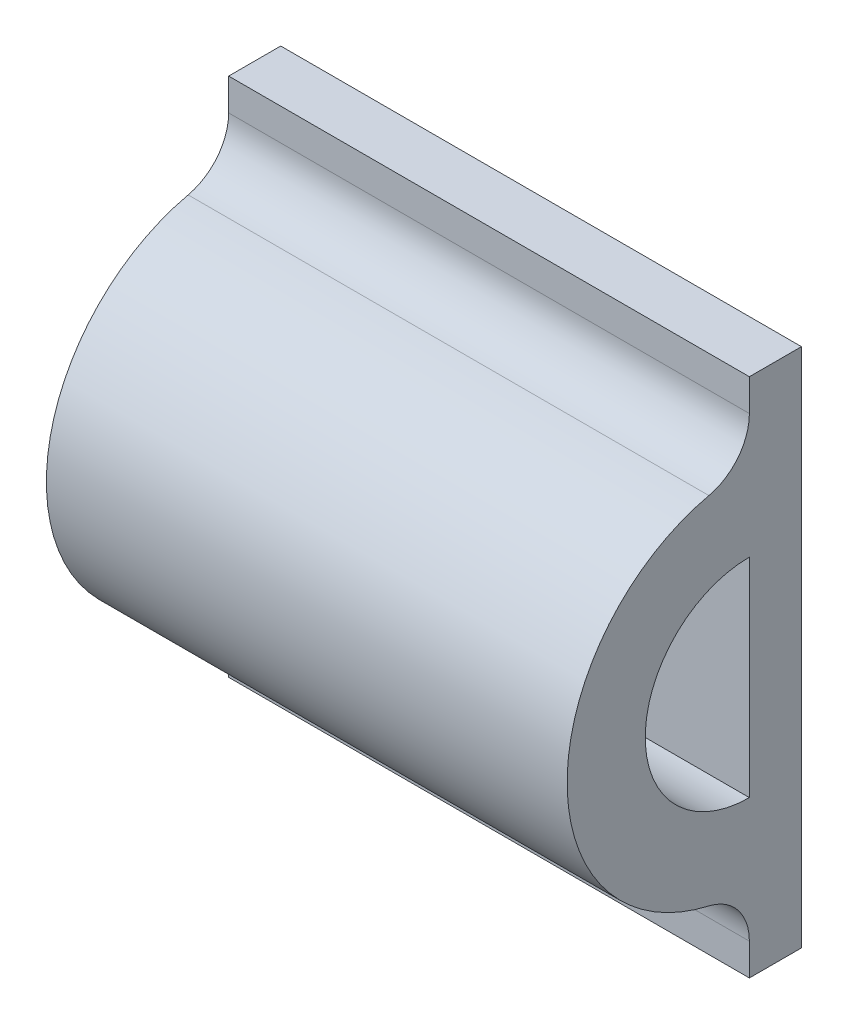
ISO-10303-21;
HEADER;
FILE_DESCRIPTION(('STEP AP214'),'2;1');
FILE_NAME('part.step','',(''),(''),'','','');
FILE_SCHEMA(('AUTOMOTIVE_DESIGN { 1 0 10303 214 1 1 1 1 }'));
ENDSEC;
DATA;
#1=APPLICATION_CONTEXT('core data for automotive mechanical design processes');
#2=APPLICATION_PROTOCOL_DEFINITION('international standard','automotive_design',2000,#1);
#3=PRODUCT_CONTEXT('',#1,'mechanical');
#4=PRODUCT('Part','Part','',(#3));
#5=PRODUCT_RELATED_PRODUCT_CATEGORY('part','',(#4));
#6=PRODUCT_DEFINITION_FORMATION('','',#4);
#7=PRODUCT_DEFINITION_CONTEXT('part definition',#1,'design');
#8=PRODUCT_DEFINITION('design','',#6,#7);
#9=PRODUCT_DEFINITION_SHAPE('','',#8);
#10=(LENGTH_UNIT() NAMED_UNIT(*) SI_UNIT(.MILLI.,.METRE.));
#11=(NAMED_UNIT(*) PLANE_ANGLE_UNIT() SI_UNIT($,.RADIAN.));
#12=(NAMED_UNIT(*) SI_UNIT($,.STERADIAN.) SOLID_ANGLE_UNIT());
#13=UNCERTAINTY_MEASURE_WITH_UNIT(LENGTH_MEASURE(1.E-05),#10,'distance_accuracy_value','');
#14=(GEOMETRIC_REPRESENTATION_CONTEXT(3) GLOBAL_UNCERTAINTY_ASSIGNED_CONTEXT((#13)) GLOBAL_UNIT_ASSIGNED_CONTEXT((#10,
#11,#12)) REPRESENTATION_CONTEXT('',''));
#15=CARTESIAN_POINT('',(0.,0.,0.));
#16=DIRECTION('',(0.,0.,1.));
#17=DIRECTION('',(1.,0.,0.));
#18=AXIS2_PLACEMENT_3D('',#15,#16,#17);
#19=CARTESIAN_POINT('',(-5.,-4.38748219369606,2.));
#20=DIRECTION('',(1.,0.,0.));
#21=DIRECTION('',(0.,0.,-1.));
#22=AXIS2_PLACEMENT_3D('',#19,#20,#21);
#23=CYLINDRICAL_SURFACE('',#22,1.);
#24=DIRECTION('',(-1.,0.,0.));
#25=VECTOR('',#24,1.);
#26=CARTESIAN_POINT('',(-5.,-4.38748219369606,1.));
#27=LINE('',#26,#25);
#28=CARTESIAN_POINT('',(5.,-4.38748219369606,1.));
#29=VERTEX_POINT('',#28);
#30=CARTESIAN_POINT('',(-5.,-4.38748219369606,1.));
#31=VERTEX_POINT('',#30);
#32=EDGE_CURVE('E212',#29,#31,#27,.T.);
#33=ORIENTED_EDGE('',*,*,#32,.F.);
#34=CARTESIAN_POINT('',(5.,-4.38748219369606,2.));
#35=DIRECTION('',(-1.,0.,0.));
#36=DIRECTION('',(0.,0.,1.));
#37=AXIS2_PLACEMENT_3D('',#34,#35,#36);
#38=CIRCLE('',#37,1.);
#39=CARTESIAN_POINT('',(5.,-3.41248615065247,1.77777777777786));
#40=VERTEX_POINT('',#39);
#41=EDGE_CURVE('E53',#29,#40,#38,.F.);
#42=ORIENTED_EDGE('',*,*,#41,.T.);
#43=DIRECTION('',(1.,0.,0.));
#44=VECTOR('',#43,1.);
#45=CARTESIAN_POINT('',(-5.,-3.41248615065249,1.77777777777778));
#46=LINE('',#45,#44);
#47=CARTESIAN_POINT('',(-5.,-3.41248615065247,1.77777777777786));
#48=VERTEX_POINT('',#47);
#49=EDGE_CURVE('E216',#48,#40,#46,.T.);
#50=ORIENTED_EDGE('',*,*,#49,.F.);
#51=CARTESIAN_POINT('',(-5.,-4.38748219369606,2.));
#52=DIRECTION('',(1.,0.,0.));
#53=DIRECTION('',(0.,0.,-1.));
#54=AXIS2_PLACEMENT_3D('',#51,#52,#53);
#55=CIRCLE('',#54,1.);
#56=EDGE_CURVE('E11',#48,#31,#55,.F.);
#57=ORIENTED_EDGE('',*,*,#56,.T.);
#58=EDGE_LOOP('',(#33,#42,#50,#57));
#59=FACE_BOUND('',#58,.T.);
#60=ADVANCED_FACE('F45',(#59),#23,.F.);
#61=CARTESIAN_POINT('',(-5.,4.38748219369606,2.));
#62=DIRECTION('',(1.,0.,0.));
#63=DIRECTION('',(0.,0.,-1.));
#64=AXIS2_PLACEMENT_3D('',#61,#62,#63);
#65=CYLINDRICAL_SURFACE('',#64,1.);
#66=DIRECTION('',(-1.,0.,0.));
#67=VECTOR('',#66,1.);
#68=CARTESIAN_POINT('',(-5.,4.38748219369606,1.));
#69=LINE('',#68,#67);
#70=CARTESIAN_POINT('',(-5.,4.38748219369606,1.));
#71=VERTEX_POINT('',#70);
#72=CARTESIAN_POINT('',(5.,4.38748219369606,1.));
#73=VERTEX_POINT('',#72);
#74=EDGE_CURVE('E197',#71,#73,#69,.F.);
#75=ORIENTED_EDGE('',*,*,#74,.F.);
#76=CARTESIAN_POINT('',(-5.,4.38748219369606,2.));
#77=DIRECTION('',(1.,0.,0.));
#78=DIRECTION('',(0.,0.,-1.));
#79=AXIS2_PLACEMENT_3D('',#76,#77,#78);
#80=CIRCLE('',#79,1.);
#81=CARTESIAN_POINT('',(-5.,3.41248615065249,1.77777777777778));
#82=VERTEX_POINT('',#81);
#83=EDGE_CURVE('E205',#71,#82,#80,.F.);
#84=ORIENTED_EDGE('',*,*,#83,.T.);
#85=DIRECTION('',(1.,0.,0.));
#86=VECTOR('',#85,1.);
#87=CARTESIAN_POINT('',(-5.,3.41248615065249,1.77777777777778));
#88=LINE('',#87,#86);
#89=CARTESIAN_POINT('',(5.,3.41248615065249,1.77777777777778));
#90=VERTEX_POINT('',#89);
#91=EDGE_CURVE('E201',#90,#82,#88,.F.);
#92=ORIENTED_EDGE('',*,*,#91,.F.);
#93=CARTESIAN_POINT('',(5.,4.38748219369606,2.));
#94=DIRECTION('',(-1.,0.,0.));
#95=DIRECTION('',(0.,0.,1.));
#96=AXIS2_PLACEMENT_3D('',#93,#94,#95);
#97=CIRCLE('',#96,1.);
#98=EDGE_CURVE('E209',#90,#73,#97,.F.);
#99=ORIENTED_EDGE('',*,*,#98,.T.);
#100=EDGE_LOOP('',(#75,#84,#92,#99));
#101=FACE_BOUND('',#100,.T.);
#102=ADVANCED_FACE('F240',(#101),#65,.F.);
#103=CARTESIAN_POINT('',(0.,0.,1.));
#104=DIRECTION('',(0.,0.,-1.));
#105=DIRECTION('',(-1.,0.,0.));
#106=AXIS2_PLACEMENT_3D('',#103,#104,#105);
#107=PLANE('',#106);
#108=DIRECTION('',(0.,-1.,0.));
#109=VECTOR('',#108,1.);
#110=CARTESIAN_POINT('',(-5.,5.,1.));
#111=LINE('',#110,#109);
#112=CARTESIAN_POINT('',(-5.,5.,1.));
#113=VERTEX_POINT('',#112);
#114=EDGE_CURVE('E156',#113,#71,#111,.T.);
#115=ORIENTED_EDGE('',*,*,#114,.T.);
#116=ORIENTED_EDGE('',*,*,#74,.T.);
#117=DIRECTION('',(0.,1.,0.));
#118=VECTOR('',#117,1.);
#119=CARTESIAN_POINT('',(5.,5.,1.));
#120=LINE('',#119,#118);
#121=CARTESIAN_POINT('',(5.,5.,1.));
#122=VERTEX_POINT('',#121);
#123=EDGE_CURVE('E128',#73,#122,#120,.T.);
#124=ORIENTED_EDGE('',*,*,#123,.T.);
#125=DIRECTION('',(-1.,0.,0.));
#126=VECTOR('',#125,1.);
#127=CARTESIAN_POINT('',(5.,5.,1.));
#128=LINE('',#127,#126);
#129=EDGE_CURVE('E166',#122,#113,#128,.T.);
#130=ORIENTED_EDGE('',*,*,#129,.T.);
#131=EDGE_LOOP('',(#115,#116,#124,#130));
#132=FACE_BOUND('',#131,.T.);
#133=ADVANCED_FACE('F236',(#132),#107,.F.);
#134=CARTESIAN_POINT('',(5.,-5.,1.));
#135=VERTEX_POINT('',#134);
#136=EDGE_CURVE('E127',#135,#29,#120,.T.);
#137=ORIENTED_EDGE('',*,*,#136,.T.);
#138=ORIENTED_EDGE('',*,*,#32,.T.);
#139=CARTESIAN_POINT('',(-5.,-5.,1.));
#140=VERTEX_POINT('',#139);
#141=EDGE_CURVE('E161',#31,#140,#111,.T.);
#142=ORIENTED_EDGE('',*,*,#141,.T.);
#143=DIRECTION('',(1.,0.,0.));
#144=VECTOR('',#143,1.);
#145=CARTESIAN_POINT('',(5.,-5.,1.));
#146=LINE('',#145,#144);
#147=EDGE_CURVE('E160',#140,#135,#146,.T.);
#148=ORIENTED_EDGE('',*,*,#147,.T.);
#149=EDGE_LOOP('',(#137,#138,#142,#148));
#150=FACE_BOUND('',#149,.T.);
#151=ADVANCED_FACE('F227',(#150),#107,.F.);
#152=CARTESIAN_POINT('',(-5.,5.,1.));
#153=DIRECTION('',(1.,0.,0.));
#154=DIRECTION('',(0.,0.,-1.));
#155=AXIS2_PLACEMENT_3D('',#152,#153,#154);
#156=PLANE('',#155);
#157=ORIENTED_EDGE('',*,*,#56,.F.);
#158=CARTESIAN_POINT('',(-5.,0.,1.));
#159=DIRECTION('',(-1.,0.,0.));
#160=DIRECTION('',(0.,0.,1.));
#161=AXIS2_PLACEMENT_3D('',#158,#159,#160);
#162=CIRCLE('',#161,3.5);
#163=EDGE_CURVE('E144',#48,#82,#162,.T.);
#164=ORIENTED_EDGE('',*,*,#163,.T.);
#165=ORIENTED_EDGE('',*,*,#83,.F.);
#166=ORIENTED_EDGE('',*,*,#114,.F.);
#167=DIRECTION('',(0.,0.,-1.));
#168=VECTOR('',#167,1.);
#169=CARTESIAN_POINT('',(-5.,5.,1.));
#170=LINE('',#169,#168);
#171=CARTESIAN_POINT('',(-5.,5.,0.));
#172=VERTEX_POINT('',#171);
#173=EDGE_CURVE('E169',#113,#172,#170,.T.);
#174=ORIENTED_EDGE('',*,*,#173,.T.);
#175=DIRECTION('',(0.,-1.,0.));
#176=VECTOR('',#175,1.);
#177=CARTESIAN_POINT('',(-5.,5.,0.));
#178=LINE('',#177,#176);
#179=CARTESIAN_POINT('',(-5.,-5.,0.));
#180=VERTEX_POINT('',#179);
#181=EDGE_CURVE('E154',#172,#180,#178,.T.);
#182=ORIENTED_EDGE('',*,*,#181,.T.);
#183=DIRECTION('',(0.,0.,-1.));
#184=VECTOR('',#183,1.);
#185=CARTESIAN_POINT('',(-5.,-5.,1.));
#186=LINE('',#185,#184);
#187=EDGE_CURVE('E193',#140,#180,#186,.T.);
#188=ORIENTED_EDGE('',*,*,#187,.F.);
#189=ORIENTED_EDGE('',*,*,#141,.F.);
#190=EDGE_LOOP('',(#157,#164,#165,#166,#174,#182,#188,#189));
#191=FACE_BOUND('',#190,.T.);
#192=CARTESIAN_POINT('',(-5.,0.,1.));
#193=DIRECTION('',(-1.,0.,0.));
#194=DIRECTION('',(0.,0.,1.));
#195=AXIS2_PLACEMENT_3D('',#192,#193,#194);
#196=CIRCLE('',#195,2.);
#197=CARTESIAN_POINT('',(-5.,-2.,1.));
#198=VERTEX_POINT('',#197);
#199=CARTESIAN_POINT('',(-5.,2.,1.));
#200=VERTEX_POINT('',#199);
#201=EDGE_CURVE('E140',#198,#200,#196,.T.);
#202=ORIENTED_EDGE('',*,*,#201,.F.);
#203=EDGE_CURVE('E134',#200,#198,#111,.T.);
#204=ORIENTED_EDGE('',*,*,#203,.F.);
#205=EDGE_LOOP('',(#202,#204));
#206=FACE_BOUND('',#205,.T.);
#207=ADVANCED_FACE('F224',(#191,#206),#156,.F.);
#208=CARTESIAN_POINT('',(5.,-5.,1.));
#209=DIRECTION('',(0.,1.,0.));
#210=DIRECTION('',(-1.,0.,0.));
#211=AXIS2_PLACEMENT_3D('',#208,#209,#210);
#212=PLANE('',#211);
#213=DIRECTION('',(1.,0.,0.));
#214=VECTOR('',#213,1.);
#215=CARTESIAN_POINT('',(5.,-5.,0.));
#216=LINE('',#215,#214);
#217=CARTESIAN_POINT('',(5.,-5.,0.));
#218=VERTEX_POINT('',#217);
#219=EDGE_CURVE('E173',#180,#218,#216,.T.);
#220=ORIENTED_EDGE('',*,*,#219,.T.);
#221=DIRECTION('',(0.,0.,-1.));
#222=VECTOR('',#221,1.);
#223=CARTESIAN_POINT('',(5.,-5.,1.));
#224=LINE('',#223,#222);
#225=EDGE_CURVE('E189',#135,#218,#224,.T.);
#226=ORIENTED_EDGE('',*,*,#225,.F.);
#227=ORIENTED_EDGE('',*,*,#147,.F.);
#228=ORIENTED_EDGE('',*,*,#187,.T.);
#229=EDGE_LOOP('',(#220,#226,#227,#228));
#230=FACE_BOUND('',#229,.T.);
#231=ADVANCED_FACE('F226',(#230),#212,.F.);
#232=CARTESIAN_POINT('',(5.,5.,1.));
#233=DIRECTION('',(-1.,0.,0.));
#234=DIRECTION('',(0.,0.,1.));
#235=AXIS2_PLACEMENT_3D('',#232,#233,#234);
#236=PLANE('',#235);
#237=CARTESIAN_POINT('',(5.,-2.,1.));
#238=VERTEX_POINT('',#237);
#239=CARTESIAN_POINT('',(5.,2.,1.));
#240=VERTEX_POINT('',#239);
#241=EDGE_CURVE('E118',#238,#240,#120,.T.);
#242=ORIENTED_EDGE('',*,*,#241,.F.);
#243=CARTESIAN_POINT('',(5.,0.,1.));
#244=DIRECTION('',(-1.,0.,0.));
#245=DIRECTION('',(0.,0.,1.));
#246=AXIS2_PLACEMENT_3D('',#243,#244,#245);
#247=CIRCLE('',#246,2.);
#248=EDGE_CURVE('E123',#238,#240,#247,.T.);
#249=ORIENTED_EDGE('',*,*,#248,.T.);
#250=EDGE_LOOP('',(#242,#249));
#251=FACE_BOUND('',#250,.T.);
#252=DIRECTION('',(0.,1.,0.));
#253=VECTOR('',#252,1.);
#254=CARTESIAN_POINT('',(5.,5.,0.));
#255=LINE('',#254,#253);
#256=CARTESIAN_POINT('',(5.,5.,0.));
#257=VERTEX_POINT('',#256);
#258=EDGE_CURVE('E176',#218,#257,#255,.T.);
#259=ORIENTED_EDGE('',*,*,#258,.T.);
#260=DIRECTION('',(0.,0.,-1.));
#261=VECTOR('',#260,1.);
#262=CARTESIAN_POINT('',(5.,5.,1.));
#263=LINE('',#262,#261);
#264=EDGE_CURVE('E185',#122,#257,#263,.T.);
#265=ORIENTED_EDGE('',*,*,#264,.F.);
#266=ORIENTED_EDGE('',*,*,#123,.F.);
#267=ORIENTED_EDGE('',*,*,#98,.F.);
#268=CARTESIAN_POINT('',(5.,0.,1.));
#269=DIRECTION('',(-1.,0.,0.));
#270=DIRECTION('',(0.,0.,1.));
#271=AXIS2_PLACEMENT_3D('',#268,#269,#270);
#272=CIRCLE('',#271,3.5);
#273=EDGE_CURVE('E145',#40,#90,#272,.T.);
#274=ORIENTED_EDGE('',*,*,#273,.F.);
#275=ORIENTED_EDGE('',*,*,#41,.F.);
#276=ORIENTED_EDGE('',*,*,#136,.F.);
#277=ORIENTED_EDGE('',*,*,#225,.T.);
#278=EDGE_LOOP('',(#259,#265,#266,#267,#274,#275,#276,#277));
#279=FACE_BOUND('',#278,.T.);
#280=ADVANCED_FACE('F120',(#251,#279),#236,.F.);
#281=CARTESIAN_POINT('',(5.,5.,1.));
#282=DIRECTION('',(0.,-1.,0.));
#283=DIRECTION('',(1.,0.,0.));
#284=AXIS2_PLACEMENT_3D('',#281,#282,#283);
#285=PLANE('',#284);
#286=DIRECTION('',(-1.,0.,0.));
#287=VECTOR('',#286,1.);
#288=CARTESIAN_POINT('',(5.,5.,0.));
#289=LINE('',#288,#287);
#290=EDGE_CURVE('E179',#257,#172,#289,.T.);
#291=ORIENTED_EDGE('',*,*,#290,.T.);
#292=ORIENTED_EDGE('',*,*,#173,.F.);
#293=ORIENTED_EDGE('',*,*,#129,.F.);
#294=ORIENTED_EDGE('',*,*,#264,.T.);
#295=EDGE_LOOP('',(#291,#292,#293,#294));
#296=FACE_BOUND('',#295,.T.);
#297=ADVANCED_FACE('F269',(#296),#285,.F.);
#298=ORIENTED_EDGE('',*,*,#241,.T.);
#299=DIRECTION('',(1.,0.,0.));
#300=VECTOR('',#299,1.);
#301=CARTESIAN_POINT('',(-5.,2.,1.));
#302=LINE('',#301,#300);
#303=EDGE_CURVE('E139',#200,#240,#302,.T.);
#304=ORIENTED_EDGE('',*,*,#303,.F.);
#305=ORIENTED_EDGE('',*,*,#203,.T.);
#306=DIRECTION('',(1.,0.,0.));
#307=VECTOR('',#306,1.);
#308=CARTESIAN_POINT('',(-5.,-2.,1.));
#309=LINE('',#308,#307);
#310=EDGE_CURVE('E131',#198,#238,#309,.T.);
#311=ORIENTED_EDGE('',*,*,#310,.T.);
#312=EDGE_LOOP('',(#298,#304,#305,#311));
#313=FACE_BOUND('',#312,.T.);
#314=ADVANCED_FACE('F132',(#313),#107,.F.);
#315=CARTESIAN_POINT('',(0.,0.,0.));
#316=DIRECTION('',(0.,0.,-1.));
#317=DIRECTION('',(-1.,0.,0.));
#318=AXIS2_PLACEMENT_3D('',#315,#316,#317);
#319=PLANE('',#318);
#320=ORIENTED_EDGE('',*,*,#181,.F.);
#321=ORIENTED_EDGE('',*,*,#290,.F.);
#322=ORIENTED_EDGE('',*,*,#258,.F.);
#323=ORIENTED_EDGE('',*,*,#219,.F.);
#324=EDGE_LOOP('',(#320,#321,#322,#323));
#325=FACE_BOUND('',#324,.T.);
#326=ADVANCED_FACE('F267',(#325),#319,.T.);
#327=CARTESIAN_POINT('',(-5.,0.,1.));
#328=DIRECTION('',(1.,0.,0.));
#329=DIRECTION('',(0.,0.,-1.));
#330=AXIS2_PLACEMENT_3D('',#327,#328,#329);
#331=CYLINDRICAL_SURFACE('',#330,2.);
#332=ORIENTED_EDGE('',*,*,#248,.F.);
#333=ORIENTED_EDGE('',*,*,#310,.F.);
#334=ORIENTED_EDGE('',*,*,#201,.T.);
#335=ORIENTED_EDGE('',*,*,#303,.T.);
#336=EDGE_LOOP('',(#332,#333,#334,#335));
#337=FACE_BOUND('',#336,.T.);
#338=ADVANCED_FACE('F142',(#337),#331,.F.);
#339=CARTESIAN_POINT('',(-5.,0.,1.));
#340=DIRECTION('',(1.,0.,0.));
#341=DIRECTION('',(0.,0.,-1.));
#342=AXIS2_PLACEMENT_3D('',#339,#340,#341);
#343=CYLINDRICAL_SURFACE('',#342,3.5);
#344=ORIENTED_EDGE('',*,*,#163,.F.);
#345=ORIENTED_EDGE('',*,*,#49,.T.);
#346=ORIENTED_EDGE('',*,*,#273,.T.);
#347=ORIENTED_EDGE('',*,*,#91,.T.);
#348=EDGE_LOOP('',(#344,#345,#346,#347));
#349=FACE_BOUND('',#348,.T.);
#350=ADVANCED_FACE('F256',(#349),#343,.T.);
#351=CLOSED_SHELL('',(#60,#102,#133,#151,#207,#231,#280,#297,#314,#326,#338,#350));
#352=MANIFOLD_SOLID_BREP('B2',#351);
#353=ADVANCED_BREP_SHAPE_REPRESENTATION('',(#18,#352),#14);
#354=SHAPE_DEFINITION_REPRESENTATION(#9,#353);
ENDSEC;
END-ISO-10303-21;
